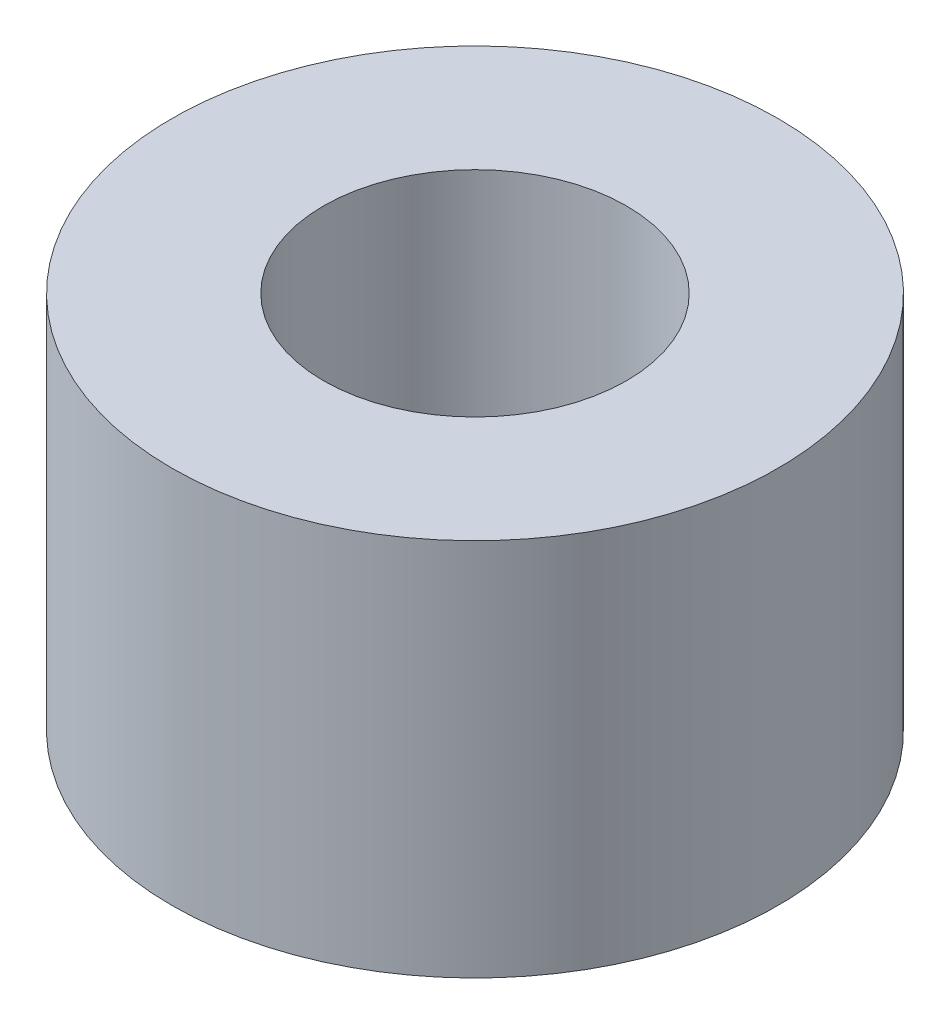
ISO-10303-21;
HEADER;
FILE_DESCRIPTION(('STEP AP214'),'2;1');
FILE_NAME('part.step','',(''),(''),'','','');
FILE_SCHEMA(('AUTOMOTIVE_DESIGN { 1 0 10303 214 1 1 1 1 }'));
ENDSEC;
DATA;
#1=APPLICATION_CONTEXT('core data for automotive mechanical design processes');
#2=APPLICATION_PROTOCOL_DEFINITION('international standard','automotive_design',2000,#1);
#3=PRODUCT_CONTEXT('',#1,'mechanical');
#4=PRODUCT('Part','Part','',(#3));
#5=PRODUCT_RELATED_PRODUCT_CATEGORY('part','',(#4));
#6=PRODUCT_DEFINITION_FORMATION('','',#4);
#7=PRODUCT_DEFINITION_CONTEXT('part definition',#1,'design');
#8=PRODUCT_DEFINITION('design','',#6,#7);
#9=PRODUCT_DEFINITION_SHAPE('','',#8);
#10=(LENGTH_UNIT() NAMED_UNIT(*) SI_UNIT(.MILLI.,.METRE.));
#11=(NAMED_UNIT(*) PLANE_ANGLE_UNIT() SI_UNIT($,.RADIAN.));
#12=(NAMED_UNIT(*) SI_UNIT($,.STERADIAN.) SOLID_ANGLE_UNIT());
#13=UNCERTAINTY_MEASURE_WITH_UNIT(LENGTH_MEASURE(1.E-05),#10,'distance_accuracy_value','');
#14=(GEOMETRIC_REPRESENTATION_CONTEXT(3) GLOBAL_UNCERTAINTY_ASSIGNED_CONTEXT((#13)) GLOBAL_UNIT_ASSIGNED_CONTEXT((#10,
#11,#12)) REPRESENTATION_CONTEXT('',''));
#15=CARTESIAN_POINT('',(0.,0.,0.));
#16=DIRECTION('',(0.,0.,1.));
#17=DIRECTION('',(1.,0.,0.));
#18=AXIS2_PLACEMENT_3D('',#15,#16,#17);
#19=CARTESIAN_POINT('',(0.,2.5,0.));
#20=DIRECTION('',(0.,1.,0.));
#21=DIRECTION('',(0.,0.,1.));
#22=AXIS2_PLACEMENT_3D('',#19,#20,#21);
#23=PLANE('',#22);
#24=CARTESIAN_POINT('',(0.,2.5,0.));
#25=DIRECTION('',(0.,1.,0.));
#26=DIRECTION('',(0.,0.,1.));
#27=AXIS2_PLACEMENT_3D('',#24,#25,#26);
#28=CIRCLE('',#27,2.);
#29=CARTESIAN_POINT('',(0.,2.5,2.));
#30=VERTEX_POINT('',#29);
#31=EDGE_CURVE('E10',#30,#30,#28,.T.);
#32=ORIENTED_EDGE('',*,*,#31,.T.);
#33=EDGE_LOOP('',(#32));
#34=FACE_BOUND('',#33,.T.);
#35=CARTESIAN_POINT('',(0.,2.5,0.));
#36=DIRECTION('',(0.,1.,0.));
#37=DIRECTION('',(0.,0.,1.));
#38=AXIS2_PLACEMENT_3D('',#35,#36,#37);
#39=CIRCLE('',#38,1.);
#40=CARTESIAN_POINT('',(0.,2.5,1.));
#41=VERTEX_POINT('',#40);
#42=EDGE_CURVE('E44',#41,#41,#39,.T.);
#43=ORIENTED_EDGE('',*,*,#42,.F.);
#44=EDGE_LOOP('',(#43));
#45=FACE_BOUND('',#44,.T.);
#46=ADVANCED_FACE('F33',(#34,#45),#23,.T.);
#47=CARTESIAN_POINT('',(0.,0.,0.));
#48=DIRECTION('',(0.,1.,0.));
#49=DIRECTION('',(0.,0.,1.));
#50=AXIS2_PLACEMENT_3D('',#47,#48,#49);
#51=PLANE('',#50);
#52=CARTESIAN_POINT('',(0.,0.,0.));
#53=DIRECTION('',(0.,1.,0.));
#54=DIRECTION('',(0.,0.,1.));
#55=AXIS2_PLACEMENT_3D('',#52,#53,#54);
#56=CIRCLE('',#55,2.);
#57=CARTESIAN_POINT('',(0.,0.,2.));
#58=VERTEX_POINT('',#57);
#59=EDGE_CURVE('E37',#58,#58,#56,.T.);
#60=ORIENTED_EDGE('',*,*,#59,.F.);
#61=EDGE_LOOP('',(#60));
#62=FACE_BOUND('',#61,.T.);
#63=CARTESIAN_POINT('',(0.,0.,0.));
#64=DIRECTION('',(0.,1.,0.));
#65=DIRECTION('',(0.,0.,1.));
#66=AXIS2_PLACEMENT_3D('',#63,#64,#65);
#67=CIRCLE('',#66,1.);
#68=CARTESIAN_POINT('',(0.,0.,1.));
#69=VERTEX_POINT('',#68);
#70=EDGE_CURVE('E46',#69,#69,#67,.T.);
#71=ORIENTED_EDGE('',*,*,#70,.T.);
#72=EDGE_LOOP('',(#71));
#73=FACE_BOUND('',#72,.T.);
#74=ADVANCED_FACE('F56',(#62,#73),#51,.F.);
#75=CARTESIAN_POINT('',(0.,2.5,0.));
#76=DIRECTION('',(0.,-1.,0.));
#77=DIRECTION('',(0.,0.,-1.));
#78=AXIS2_PLACEMENT_3D('',#75,#76,#77);
#79=CYLINDRICAL_SURFACE('',#78,2.);
#80=ORIENTED_EDGE('',*,*,#31,.F.);
#81=EDGE_LOOP('',(#80));
#82=FACE_BOUND('',#81,.T.);
#83=ORIENTED_EDGE('',*,*,#59,.T.);
#84=EDGE_LOOP('',(#83));
#85=FACE_BOUND('',#84,.T.);
#86=ADVANCED_FACE('F35',(#82,#85),#79,.T.);
#87=CARTESIAN_POINT('',(0.,2.5,0.));
#88=DIRECTION('',(0.,-1.,0.));
#89=DIRECTION('',(0.,0.,-1.));
#90=AXIS2_PLACEMENT_3D('',#87,#88,#89);
#91=CYLINDRICAL_SURFACE('',#90,1.);
#92=ORIENTED_EDGE('',*,*,#42,.T.);
#93=EDGE_LOOP('',(#92));
#94=FACE_BOUND('',#93,.T.);
#95=ORIENTED_EDGE('',*,*,#70,.F.);
#96=EDGE_LOOP('',(#95));
#97=FACE_BOUND('',#96,.T.);
#98=ADVANCED_FACE('F52',(#94,#97),#91,.F.);
#99=CLOSED_SHELL('',(#46,#74,#86,#98));
#100=MANIFOLD_SOLID_BREP('B2',#99);
#101=ADVANCED_BREP_SHAPE_REPRESENTATION('',(#18,#100),#14);
#102=SHAPE_DEFINITION_REPRESENTATION(#9,#101);
ENDSEC;
END-ISO-10303-21;
